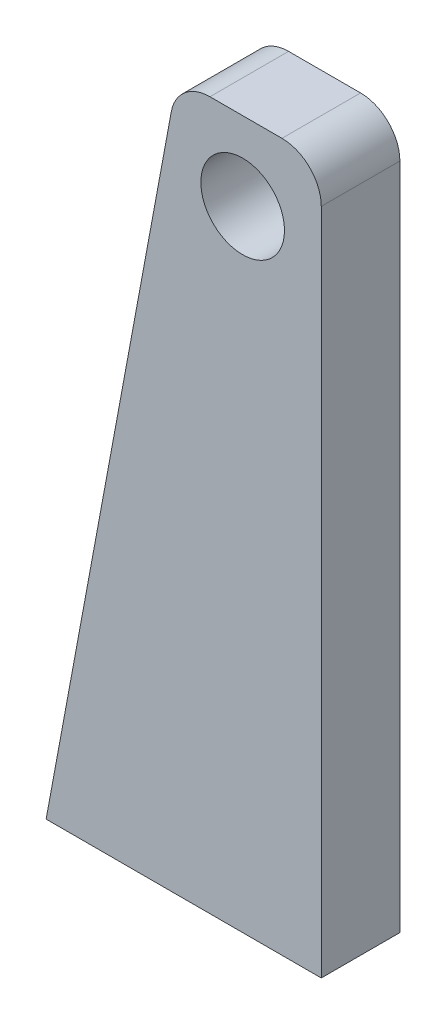
ISO-10303-21;
HEADER;
FILE_DESCRIPTION(('STEP AP214'),'2;1');
FILE_NAME('part.step','',(''),(''),'','','');
FILE_SCHEMA(('AUTOMOTIVE_DESIGN { 1 0 10303 214 1 1 1 1 }'));
ENDSEC;
DATA;
#1=APPLICATION_CONTEXT('core data for automotive mechanical design processes');
#2=APPLICATION_PROTOCOL_DEFINITION('international standard','automotive_design',2000,#1);
#3=PRODUCT_CONTEXT('',#1,'mechanical');
#4=PRODUCT('Part','Part','',(#3));
#5=PRODUCT_RELATED_PRODUCT_CATEGORY('part','',(#4));
#6=PRODUCT_DEFINITION_FORMATION('','',#4);
#7=PRODUCT_DEFINITION_CONTEXT('part definition',#1,'design');
#8=PRODUCT_DEFINITION('design','',#6,#7);
#9=PRODUCT_DEFINITION_SHAPE('','',#8);
#10=(LENGTH_UNIT() NAMED_UNIT(*) SI_UNIT(.MILLI.,.METRE.));
#11=(NAMED_UNIT(*) PLANE_ANGLE_UNIT() SI_UNIT($,.RADIAN.));
#12=(NAMED_UNIT(*) SI_UNIT($,.STERADIAN.) SOLID_ANGLE_UNIT());
#13=UNCERTAINTY_MEASURE_WITH_UNIT(LENGTH_MEASURE(1.E-05),#10,'distance_accuracy_value','');
#14=(GEOMETRIC_REPRESENTATION_CONTEXT(3) GLOBAL_UNCERTAINTY_ASSIGNED_CONTEXT((#13)) GLOBAL_UNIT_ASSIGNED_CONTEXT((#10,
#11,#12)) REPRESENTATION_CONTEXT('',''));
#15=CARTESIAN_POINT('',(0.,0.,0.));
#16=DIRECTION('',(0.,0.,1.));
#17=DIRECTION('',(1.,0.,0.));
#18=AXIS2_PLACEMENT_3D('',#15,#16,#17);
#19=CARTESIAN_POINT('',(-3.175,53.975,6.35));
#20=DIRECTION('',(0.,0.,1.));
#21=DIRECTION('',(1.,0.,0.));
#22=AXIS2_PLACEMENT_3D('',#19,#20,#21);
#23=PLANE('',#22);
#24=DIRECTION('',(1.,0.,0.));
#25=VECTOR('',#24,1.);
#26=CARTESIAN_POINT('',(-22.225,0.,6.35));
#27=LINE('',#26,#25);
#28=CARTESIAN_POINT('',(-22.225,0.,6.35));
#29=VERTEX_POINT('',#28);
#30=CARTESIAN_POINT('',(0.,0.,6.35));
#31=VERTEX_POINT('',#30);
#32=EDGE_CURVE('E133',#29,#31,#27,.T.);
#33=ORIENTED_EDGE('',*,*,#32,.T.);
#34=DIRECTION('',(0.,1.,0.));
#35=VECTOR('',#34,1.);
#36=CARTESIAN_POINT('',(0.,0.,6.35));
#37=LINE('',#36,#35);
#38=CARTESIAN_POINT('',(0.,53.975,6.35));
#39=VERTEX_POINT('',#38);
#40=EDGE_CURVE('E91',#31,#39,#37,.T.);
#41=ORIENTED_EDGE('',*,*,#40,.T.);
#42=CARTESIAN_POINT('',(-3.175,53.975,6.35));
#43=DIRECTION('',(0.,0.,1.));
#44=DIRECTION('',(1.,0.,0.));
#45=AXIS2_PLACEMENT_3D('',#42,#43,#44);
#46=CIRCLE('',#45,3.175);
#47=CARTESIAN_POINT('',(-3.175,57.15,6.35));
#48=VERTEX_POINT('',#47);
#49=EDGE_CURVE('E104',#39,#48,#46,.T.);
#50=ORIENTED_EDGE('',*,*,#49,.T.);
#51=DIRECTION('',(-1.,0.,0.));
#52=VECTOR('',#51,1.);
#53=CARTESIAN_POINT('',(-3.175,57.15,6.35));
#54=LINE('',#53,#52);
#55=CARTESIAN_POINT('',(-8.99053795730507,57.15,6.35));
#56=VERTEX_POINT('',#55);
#57=EDGE_CURVE('E98',#48,#56,#54,.T.);
#58=ORIENTED_EDGE('',*,*,#57,.T.);
#59=CARTESIAN_POINT('',(-8.99053795730507,53.975,6.35));
#60=DIRECTION('',(0.,0.,1.));
#61=DIRECTION('',(1.,0.,0.));
#62=AXIS2_PLACEMENT_3D('',#59,#60,#61);
#63=CIRCLE('',#62,3.175);
#64=CARTESIAN_POINT('',(-12.112354691954,54.5536927295778,6.35));
#65=VERTEX_POINT('',#64);
#66=EDGE_CURVE('E102',#56,#65,#63,.T.);
#67=ORIENTED_EDGE('',*,*,#66,.T.);
#68=DIRECTION('',(-0.18226542663867,-0.983249365243743,0.));
#69=VECTOR('',#68,1.);
#70=CARTESIAN_POINT('',(-12.112354691954,54.5536927295778,6.35));
#71=LINE('',#70,#69);
#72=EDGE_CURVE('E54',#65,#29,#71,.T.);
#73=ORIENTED_EDGE('',*,*,#72,.T.);
#74=EDGE_LOOP('',(#33,#41,#50,#58,#67,#73));
#75=FACE_BOUND('',#74,.T.);
#76=CARTESIAN_POINT('',(-6.35,50.8,6.35));
#77=DIRECTION('',(0.,0.,1.));
#78=DIRECTION('',(1.,0.,0.));
#79=AXIS2_PLACEMENT_3D('',#76,#77,#78);
#80=CIRCLE('',#79,3.3782);
#81=CARTESIAN_POINT('',(-2.9718,50.8,6.35));
#82=VERTEX_POINT('',#81);
#83=EDGE_CURVE('E126',#82,#82,#80,.T.);
#84=ORIENTED_EDGE('',*,*,#83,.F.);
#85=EDGE_LOOP('',(#84));
#86=FACE_BOUND('',#85,.T.);
#87=ADVANCED_FACE('F37',(#75,#86),#23,.T.);
#88=CARTESIAN_POINT('',(-3.175,53.975,0.));
#89=DIRECTION('',(0.,0.,1.));
#90=DIRECTION('',(1.,0.,0.));
#91=AXIS2_PLACEMENT_3D('',#88,#89,#90);
#92=PLANE('',#91);
#93=DIRECTION('',(1.,0.,0.));
#94=VECTOR('',#93,1.);
#95=CARTESIAN_POINT('',(-22.225,0.,0.));
#96=LINE('',#95,#94);
#97=CARTESIAN_POINT('',(-22.225,0.,0.));
#98=VERTEX_POINT('',#97);
#99=CARTESIAN_POINT('',(0.,0.,0.));
#100=VERTEX_POINT('',#99);
#101=EDGE_CURVE('E122',#98,#100,#96,.T.);
#102=ORIENTED_EDGE('',*,*,#101,.F.);
#103=DIRECTION('',(-0.18226542663867,-0.983249365243743,0.));
#104=VECTOR('',#103,1.);
#105=CARTESIAN_POINT('',(-12.112354691954,54.5536927295778,0.));
#106=LINE('',#105,#104);
#107=CARTESIAN_POINT('',(-12.112354691954,54.5536927295778,0.));
#108=VERTEX_POINT('',#107);
#109=EDGE_CURVE('E83',#108,#98,#106,.T.);
#110=ORIENTED_EDGE('',*,*,#109,.F.);
#111=CARTESIAN_POINT('',(-8.99053795730507,53.975,0.));
#112=DIRECTION('',(0.,0.,1.));
#113=DIRECTION('',(1.,0.,0.));
#114=AXIS2_PLACEMENT_3D('',#111,#112,#113);
#115=CIRCLE('',#114,3.175);
#116=CARTESIAN_POINT('',(-8.99053795730507,57.15,0.));
#117=VERTEX_POINT('',#116);
#118=EDGE_CURVE('E77',#117,#108,#115,.T.);
#119=ORIENTED_EDGE('',*,*,#118,.F.);
#120=DIRECTION('',(-1.,0.,0.));
#121=VECTOR('',#120,1.);
#122=CARTESIAN_POINT('',(-3.175,57.15,0.));
#123=LINE('',#122,#121);
#124=CARTESIAN_POINT('',(-3.175,57.15,0.));
#125=VERTEX_POINT('',#124);
#126=EDGE_CURVE('E112',#125,#117,#123,.T.);
#127=ORIENTED_EDGE('',*,*,#126,.F.);
#128=CARTESIAN_POINT('',(-3.175,53.975,0.));
#129=DIRECTION('',(0.,0.,1.));
#130=DIRECTION('',(1.,0.,0.));
#131=AXIS2_PLACEMENT_3D('',#128,#129,#130);
#132=CIRCLE('',#131,3.175);
#133=CARTESIAN_POINT('',(0.,53.975,0.));
#134=VERTEX_POINT('',#133);
#135=EDGE_CURVE('E128',#134,#125,#132,.T.);
#136=ORIENTED_EDGE('',*,*,#135,.F.);
#137=DIRECTION('',(0.,1.,0.));
#138=VECTOR('',#137,1.);
#139=CARTESIAN_POINT('',(0.,0.,0.));
#140=LINE('',#139,#138);
#141=EDGE_CURVE('E125',#100,#134,#140,.T.);
#142=ORIENTED_EDGE('',*,*,#141,.F.);
#143=EDGE_LOOP('',(#102,#110,#119,#127,#136,#142));
#144=FACE_BOUND('',#143,.T.);
#145=CARTESIAN_POINT('',(-6.35,50.8,0.));
#146=DIRECTION('',(0.,0.,1.));
#147=DIRECTION('',(1.,0.,0.));
#148=AXIS2_PLACEMENT_3D('',#145,#146,#147);
#149=CIRCLE('',#148,3.3782);
#150=CARTESIAN_POINT('',(-2.9718,50.8,0.));
#151=VERTEX_POINT('',#150);
#152=EDGE_CURVE('E226',#151,#151,#149,.T.);
#153=ORIENTED_EDGE('',*,*,#152,.T.);
#154=EDGE_LOOP('',(#153));
#155=FACE_BOUND('',#154,.T.);
#156=ADVANCED_FACE('F142',(#144,#155),#92,.F.);
#157=CARTESIAN_POINT('',(-22.225,0.,6.35));
#158=DIRECTION('',(0.,1.,0.));
#159=DIRECTION('',(0.,0.,1.));
#160=AXIS2_PLACEMENT_3D('',#157,#158,#159);
#161=PLANE('',#160);
#162=ORIENTED_EDGE('',*,*,#101,.T.);
#163=DIRECTION('',(0.,0.,-1.));
#164=VECTOR('',#163,1.);
#165=CARTESIAN_POINT('',(0.,0.,6.35));
#166=LINE('',#165,#164);
#167=EDGE_CURVE('E11',#31,#100,#166,.T.);
#168=ORIENTED_EDGE('',*,*,#167,.F.);
#169=ORIENTED_EDGE('',*,*,#32,.F.);
#170=DIRECTION('',(0.,0.,-1.));
#171=VECTOR('',#170,1.);
#172=CARTESIAN_POINT('',(-22.225,0.,6.35));
#173=LINE('',#172,#171);
#174=EDGE_CURVE('E118',#29,#98,#173,.T.);
#175=ORIENTED_EDGE('',*,*,#174,.T.);
#176=EDGE_LOOP('',(#162,#168,#169,#175));
#177=FACE_BOUND('',#176,.T.);
#178=ADVANCED_FACE('F39',(#177),#161,.F.);
#179=CARTESIAN_POINT('',(0.,0.,6.35));
#180=DIRECTION('',(-1.,0.,0.));
#181=DIRECTION('',(0.,0.,1.));
#182=AXIS2_PLACEMENT_3D('',#179,#180,#181);
#183=PLANE('',#182);
#184=ORIENTED_EDGE('',*,*,#141,.T.);
#185=DIRECTION('',(0.,0.,-1.));
#186=VECTOR('',#185,1.);
#187=CARTESIAN_POINT('',(0.,53.975,6.35));
#188=LINE('',#187,#186);
#189=EDGE_CURVE('E46',#39,#134,#188,.T.);
#190=ORIENTED_EDGE('',*,*,#189,.F.);
#191=ORIENTED_EDGE('',*,*,#40,.F.);
#192=ORIENTED_EDGE('',*,*,#167,.T.);
#193=EDGE_LOOP('',(#184,#190,#191,#192));
#194=FACE_BOUND('',#193,.T.);
#195=ADVANCED_FACE('F167',(#194),#183,.F.);
#196=CARTESIAN_POINT('',(-3.175,53.975,6.35));
#197=DIRECTION('',(0.,0.,-1.));
#198=DIRECTION('',(-1.,0.,0.));
#199=AXIS2_PLACEMENT_3D('',#196,#197,#198);
#200=CYLINDRICAL_SURFACE('',#199,3.175);
#201=ORIENTED_EDGE('',*,*,#135,.T.);
#202=DIRECTION('',(0.,0.,-1.));
#203=VECTOR('',#202,1.);
#204=CARTESIAN_POINT('',(-3.175,57.15,6.35));
#205=LINE('',#204,#203);
#206=EDGE_CURVE('E113',#48,#125,#205,.T.);
#207=ORIENTED_EDGE('',*,*,#206,.F.);
#208=ORIENTED_EDGE('',*,*,#49,.F.);
#209=ORIENTED_EDGE('',*,*,#189,.T.);
#210=EDGE_LOOP('',(#201,#207,#208,#209));
#211=FACE_BOUND('',#210,.T.);
#212=ADVANCED_FACE('F139',(#211),#200,.T.);
#213=CARTESIAN_POINT('',(-3.175,57.15,6.35));
#214=DIRECTION('',(0.,-1.,0.));
#215=DIRECTION('',(0.,0.,-1.));
#216=AXIS2_PLACEMENT_3D('',#213,#214,#215);
#217=PLANE('',#216);
#218=ORIENTED_EDGE('',*,*,#126,.T.);
#219=DIRECTION('',(0.,0.,-1.));
#220=VECTOR('',#219,1.);
#221=CARTESIAN_POINT('',(-8.99053795730507,57.15,6.35));
#222=LINE('',#221,#220);
#223=EDGE_CURVE('E109',#56,#117,#222,.T.);
#224=ORIENTED_EDGE('',*,*,#223,.F.);
#225=ORIENTED_EDGE('',*,*,#57,.F.);
#226=ORIENTED_EDGE('',*,*,#206,.T.);
#227=EDGE_LOOP('',(#218,#224,#225,#226));
#228=FACE_BOUND('',#227,.T.);
#229=ADVANCED_FACE('F110',(#228),#217,.F.);
#230=CARTESIAN_POINT('',(-8.99053795730507,53.975,6.35));
#231=DIRECTION('',(0.,0.,-1.));
#232=DIRECTION('',(-1.,0.,0.));
#233=AXIS2_PLACEMENT_3D('',#230,#231,#232);
#234=CYLINDRICAL_SURFACE('',#233,3.175);
#235=ORIENTED_EDGE('',*,*,#118,.T.);
#236=DIRECTION('',(0.,0.,-1.));
#237=VECTOR('',#236,1.);
#238=CARTESIAN_POINT('',(-12.112354691954,54.5536927295778,6.35));
#239=LINE('',#238,#237);
#240=EDGE_CURVE('E114',#65,#108,#239,.T.);
#241=ORIENTED_EDGE('',*,*,#240,.F.);
#242=ORIENTED_EDGE('',*,*,#66,.F.);
#243=ORIENTED_EDGE('',*,*,#223,.T.);
#244=EDGE_LOOP('',(#235,#241,#242,#243));
#245=FACE_BOUND('',#244,.T.);
#246=ADVANCED_FACE('F116',(#245),#234,.T.);
#247=CARTESIAN_POINT('',(-12.112354691954,54.5536927295778,6.35));
#248=DIRECTION('',(0.983249365243743,-0.18226542663867,0.));
#249=DIRECTION('',(0.18226542663867,0.983249365243743,0.));
#250=AXIS2_PLACEMENT_3D('',#247,#248,#249);
#251=PLANE('',#250);
#252=ORIENTED_EDGE('',*,*,#109,.T.);
#253=ORIENTED_EDGE('',*,*,#174,.F.);
#254=ORIENTED_EDGE('',*,*,#72,.F.);
#255=ORIENTED_EDGE('',*,*,#240,.T.);
#256=EDGE_LOOP('',(#252,#253,#254,#255));
#257=FACE_BOUND('',#256,.T.);
#258=ADVANCED_FACE('F147',(#257),#251,.F.);
#259=CARTESIAN_POINT('',(-6.35,50.8,6.35));
#260=DIRECTION('',(0.,0.,-1.));
#261=DIRECTION('',(-1.,0.,0.));
#262=AXIS2_PLACEMENT_3D('',#259,#260,#261);
#263=CYLINDRICAL_SURFACE('',#262,3.3782);
#264=ORIENTED_EDGE('',*,*,#83,.T.);
#265=EDGE_LOOP('',(#264));
#266=FACE_BOUND('',#265,.T.);
#267=ORIENTED_EDGE('',*,*,#152,.F.);
#268=EDGE_LOOP('',(#267));
#269=FACE_BOUND('',#268,.T.);
#270=ADVANCED_FACE('F149',(#266,#269),#263,.F.);
#271=CLOSED_SHELL('',(#87,#156,#178,#195,#212,#229,#246,#258,#270));
#272=MANIFOLD_SOLID_BREP('B2',#271);
#273=ADVANCED_BREP_SHAPE_REPRESENTATION('',(#18,#272),#14);
#274=SHAPE_DEFINITION_REPRESENTATION(#9,#273);
ENDSEC;
END-ISO-10303-21;
